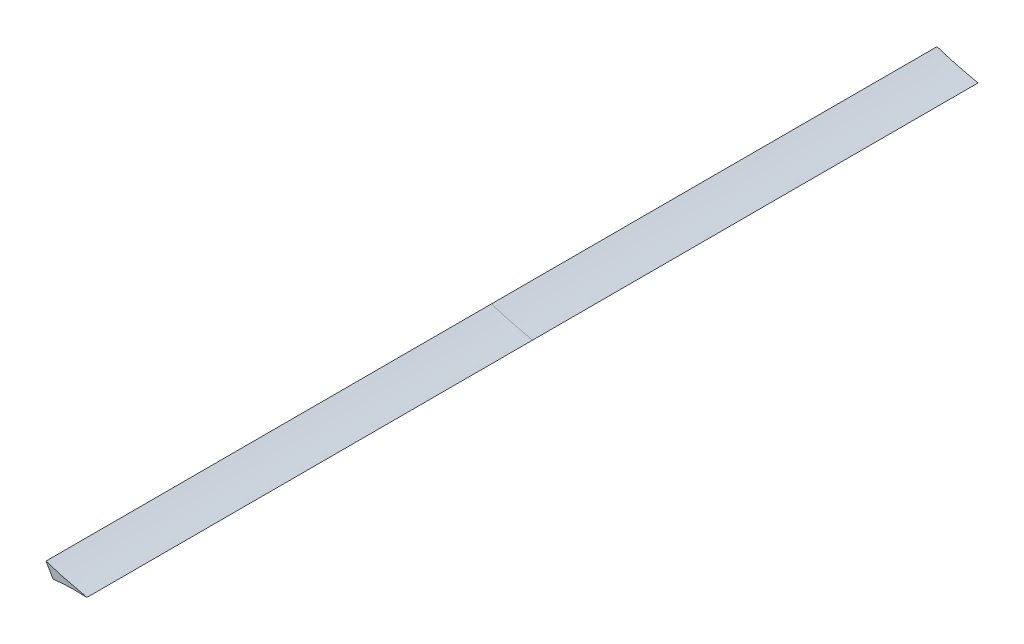
ISO-10303-21;
HEADER;
FILE_DESCRIPTION(('STEP AP214'),'2;1');
FILE_NAME('part.step','',(''),(''),'','','');
FILE_SCHEMA(('AUTOMOTIVE_DESIGN { 1 0 10303 214 1 1 1 1 }'));
ENDSEC;
DATA;
#1=APPLICATION_CONTEXT('core data for automotive mechanical design processes');
#2=APPLICATION_PROTOCOL_DEFINITION('international standard','automotive_design',2000,#1);
#3=PRODUCT_CONTEXT('',#1,'mechanical');
#4=PRODUCT('Part','Part','',(#3));
#5=PRODUCT_RELATED_PRODUCT_CATEGORY('part','',(#4));
#6=PRODUCT_DEFINITION_FORMATION('','',#4);
#7=PRODUCT_DEFINITION_CONTEXT('part definition',#1,'design');
#8=PRODUCT_DEFINITION('design','',#6,#7);
#9=PRODUCT_DEFINITION_SHAPE('','',#8);
#10=(LENGTH_UNIT() NAMED_UNIT(*) SI_UNIT(.MILLI.,.METRE.));
#11=(NAMED_UNIT(*) PLANE_ANGLE_UNIT() SI_UNIT($,.RADIAN.));
#12=(NAMED_UNIT(*) SI_UNIT($,.STERADIAN.) SOLID_ANGLE_UNIT());
#13=UNCERTAINTY_MEASURE_WITH_UNIT(LENGTH_MEASURE(1.E-05),#10,'distance_accuracy_value','');
#14=(GEOMETRIC_REPRESENTATION_CONTEXT(3) GLOBAL_UNCERTAINTY_ASSIGNED_CONTEXT((#13)) GLOBAL_UNIT_ASSIGNED_CONTEXT((#10,
#11,#12)) REPRESENTATION_CONTEXT('',''));
#15=CARTESIAN_POINT('',(0.,0.,0.));
#16=DIRECTION('',(0.,0.,1.));
#17=DIRECTION('',(1.,0.,0.));
#18=AXIS2_PLACEMENT_3D('',#15,#16,#17);
#19=CARTESIAN_POINT('',(0.,0.,225.));
#20=DIRECTION('',(0.,0.,1.));
#21=DIRECTION('',(1.,0.,0.));
#22=AXIS2_PLACEMENT_3D('',#19,#20,#21);
#23=PLANE('',#22);
#24=DIRECTION('',(0.499999999999995,-0.866025403784441,0.));
#25=VECTOR('',#24,1.);
#26=CARTESIAN_POINT('',(0.,6.45575704802336,225.));
#27=LINE('',#26,#25);
#28=CARTESIAN_POINT('',(0.,6.45575704802336,225.));
#29=VERTEX_POINT('',#28);
#30=CARTESIAN_POINT('',(3.50923831572054,0.377577989327863,225.));
#31=VERTEX_POINT('',#30);
#32=EDGE_CURVE('E77',#29,#31,#27,.T.);
#33=ORIENTED_EDGE('',*,*,#32,.T.);
#34=CARTESIAN_POINT('',(0.,0.,225.));
#35=CARTESIAN_POINT('',(0.143412686196248,0.016484913222827,225.));
#36=CARTESIAN_POINT('',(1.15599960637253,0.132169735232295,225.));
#37=CARTESIAN_POINT('',(2.20163152350003,0.245208217831339,225.));
#38=CARTESIAN_POINT('',(3.89642344180233,0.417340987119671,225.));
#39=CARTESIAN_POINT('',(4.75028727163423,0.498881267362469,225.));
#40=CARTESIAN_POINT('',(6.31461532335757,0.638348705882595,225.));
#41=CARTESIAN_POINT('',(7.1134768087235,0.704735468830722,225.));
#42=CARTESIAN_POINT('',(9.23243126054033,0.859157935634537,225.));
#43=CARTESIAN_POINT('',(10.6247063703936,0.935019609344665,225.));
#44=CARTESIAN_POINT('',(13.1229224374773,1.02816862060855,225.));
#45=CARTESIAN_POINT('',(14.2772598862957,1.05499027819146,225.));
#46=CARTESIAN_POINT('',(16.2290326857059,1.06953653121696,225.));
#47=CARTESIAN_POINT('',(17.0679399087013,1.06516197421244,225.));
#48=CARTESIAN_POINT('',(18.5748228619127,1.01721403613804,225.));
#49=CARTESIAN_POINT('',(19.2232515938076,0.986329802867523,225.));
#50=CARTESIAN_POINT('',(19.9647178327966,0.960926398622565,225.));
#51=CARTESIAN_POINT('',(20.1796426531521,0.955940474552006,225.));
#52=CARTESIAN_POINT('',(20.655932980956,0.922497650491091,225.));
#53=CARTESIAN_POINT('',(20.7683006143626,0.914396094678396,225.));
#54=CARTESIAN_POINT('',(20.6569168369895,0.938116524007671,225.));
#55=CARTESIAN_POINT('',(20.1716596740282,1.04349399864364,225.));
#56=CARTESIAN_POINT('',(19.9629663201964,1.10730144475082,225.));
#57=CARTESIAN_POINT('',(19.2301030709278,1.29991618176798,225.));
#58=CARTESIAN_POINT('',(18.579400137475,1.43689519078576,225.));
#59=CARTESIAN_POINT('',(17.064716887785,1.76430761965408,225.));
#60=CARTESIAN_POINT('',(16.2324187321515,1.95231091070916,225.));
#61=CARTESIAN_POINT('',(14.2778493461158,2.40356106670217,225.));
#62=CARTESIAN_POINT('',(13.1319193012487,2.67529946752668,225.));
#63=CARTESIAN_POINT('',(10.6235386488716,3.29081179250831,225.));
#64=CARTESIAN_POINT('',(9.24645056613313,3.6428334080049,225.));
#65=CARTESIAN_POINT('',(7.1171239213485,4.22396769928197,225.));
#66=CARTESIAN_POINT('',(6.33930323187018,4.44388241635937,225.));
#67=CARTESIAN_POINT('',(4.74987453359054,4.91290925443052,225.));
#68=CARTESIAN_POINT('',(3.05098286967538,5.43724376992468,225.));
#69=CARTESIAN_POINT('',(1.19982173982428,6.04772055569866,225.));
#70=CARTESIAN_POINT('',(0.168184003398421,6.39834523666102,225.));
#71=CARTESIAN_POINT('',(0.,6.45575704802336,225.));
#72=B_SPLINE_CURVE_WITH_KNOTS('',3,(#34,#35,#36,#37,#38,#39,#40,#41,#42,#43,#44,#45,#46,#47,#48,
#49,#50,#51,#52,#53,#54,#55,#56,#57,#58,#59,#60,#61,#62,#63,#64,#65,#66,#67,#68,#69,#70,#71),
.UNSPECIFIED.,.F.,.F.,(4,1,1,1,1,1,1,1,1,1,1,1,1,1,1,1,1,1,1,1,1,1,1,1,1,1,1,1,1,1,1,1,1,1,1,4),
(0.902429257890712,0.904464746292487,0.916799996916852,0.917258637759909,0.928486820557414,
0.928896231246836,0.939398012811482,0.939782451634662,0.958876519866814,0.959120139990651,
0.974883075914782,0.974987280763176,0.987050364706602,0.987125023612546,0.995254457623719,
0.995335095931589,0.999480576022632,0.999487806596392,1.,1.00052795687596,1.00053512169122,
1.00480669236207,1.00487594794478,1.01322439420952,1.01326482532404,1.02567252891684,
1.02569607156447,1.0419901069827,1.04209876043517,1.06195341422961,1.06210055225783,
1.0732482814661,1.07334331413919,1.08546199299339,1.09832036515421,1.10082631435623),.UNSPECIFIED.);
#73=EDGE_CURVE('E83',#31,#29,#72,.T.);
#74=ORIENTED_EDGE('',*,*,#73,.T.);
#75=EDGE_LOOP('',(#33,#74));
#76=FACE_BOUND('',#75,.T.);
#77=ADVANCED_FACE('F51',(#76),#23,.T.);
#78=CARTESIAN_POINT('',(0.,0.,450.));
#79=CARTESIAN_POINT('',(0.143412686196248,0.016484913222827,450.));
#80=CARTESIAN_POINT('',(1.15599960637253,0.132169735232295,450.));
#81=CARTESIAN_POINT('',(2.20163152350003,0.245208217831339,450.));
#82=CARTESIAN_POINT('',(3.89642344180233,0.417340987119671,450.));
#83=CARTESIAN_POINT('',(4.75028727163423,0.498881267362469,450.));
#84=CARTESIAN_POINT('',(6.31461532335757,0.638348705882595,450.));
#85=CARTESIAN_POINT('',(7.1134768087235,0.704735468830722,450.));
#86=CARTESIAN_POINT('',(9.23243126054033,0.859157935634537,450.));
#87=CARTESIAN_POINT('',(10.6247063703936,0.935019609344665,450.));
#88=CARTESIAN_POINT('',(13.1229224374773,1.02816862060855,450.));
#89=CARTESIAN_POINT('',(14.2772598862957,1.05499027819146,450.));
#90=CARTESIAN_POINT('',(16.2290326857059,1.06953653121696,450.));
#91=CARTESIAN_POINT('',(17.0679399087013,1.06516197421244,450.));
#92=CARTESIAN_POINT('',(18.5748228619127,1.01721403613804,450.));
#93=CARTESIAN_POINT('',(19.2232515938076,0.986329802867523,450.));
#94=CARTESIAN_POINT('',(19.9647178327966,0.960926398622565,450.));
#95=CARTESIAN_POINT('',(20.1796426531521,0.955940474552006,450.));
#96=CARTESIAN_POINT('',(20.655932980956,0.922497650491091,450.));
#97=CARTESIAN_POINT('',(20.7683006143626,0.914396094678396,450.));
#98=CARTESIAN_POINT('',(20.6569168369895,0.938116524007671,450.));
#99=CARTESIAN_POINT('',(20.1716596740282,1.04349399864364,450.));
#100=CARTESIAN_POINT('',(19.9629663201964,1.10730144475082,450.));
#101=CARTESIAN_POINT('',(19.2301030709278,1.29991618176798,450.));
#102=CARTESIAN_POINT('',(18.579400137475,1.43689519078576,450.));
#103=CARTESIAN_POINT('',(17.064716887785,1.76430761965408,450.));
#104=CARTESIAN_POINT('',(16.2324187321515,1.95231091070916,450.));
#105=CARTESIAN_POINT('',(14.2778493461158,2.40356106670217,450.));
#106=CARTESIAN_POINT('',(13.1319193012487,2.67529946752668,450.));
#107=CARTESIAN_POINT('',(10.6235386488716,3.29081179250831,450.));
#108=CARTESIAN_POINT('',(9.24645056613313,3.6428334080049,450.));
#109=CARTESIAN_POINT('',(7.1171239213485,4.22396769928197,450.));
#110=CARTESIAN_POINT('',(6.33930323187018,4.44388241635937,450.));
#111=CARTESIAN_POINT('',(4.74987453359054,4.91290925443052,450.));
#112=CARTESIAN_POINT('',(3.05098286967538,5.43724376992468,450.));
#113=CARTESIAN_POINT('',(1.19982173982428,6.04772055569866,450.));
#114=CARTESIAN_POINT('',(0.168184003398421,6.39834523666102,450.));
#115=CARTESIAN_POINT('',(0.,6.45575704802336,450.));
#116=B_SPLINE_CURVE_WITH_KNOTS('',3,(#78,#79,#80,#81,#82,#83,#84,#85,#86,#87,#88,#89,#90,#91,
#92,#93,#94,#95,#96,#97,#98,#99,#100,#101,#102,#103,#104,#105,#106,#107,#108,#109,#110,#111,
#112,#113,#114,#115),.UNSPECIFIED.,.F.,.F.,(4,1,1,1,1,1,1,1,1,1,1,1,1,1,1,1,1,1,1,1,1,1,1,1,1,1,
1,1,1,1,1,1,1,1,1,4),(0.902429257890712,0.904464746292487,0.916799996916852,0.917258637759909,
0.928486820557414,0.928896231246836,0.939398012811482,0.939782451634662,0.958876519866814,
0.959120139990651,0.974883075914782,0.974987280763176,0.987050364706602,0.987125023612546,
0.995254457623719,0.995335095931589,0.999480576022632,0.999487806596392,1.,1.00052795687596,
1.00053512169122,1.00480669236207,1.00487594794478,1.01322439420952,1.01326482532404,
1.02567252891684,1.02569607156447,1.0419901069827,1.04209876043517,1.06195341422961,
1.06210055225783,1.0732482814661,1.07334331413919,1.08546199299339,1.09832036515421,
1.10082631435623),.UNSPECIFIED.);
#117=DIRECTION('',(0.,0.,-1.));
#118=VECTOR('',#117,1.);
#119=SURFACE_OF_LINEAR_EXTRUSION('',#116,#118);
#120=ORIENTED_EDGE('',*,*,#73,.F.);
#121=DIRECTION('',(0.,0.,-1.));
#122=VECTOR('',#121,1.);
#123=CARTESIAN_POINT('',(3.50923831572054,0.377577989327863,450.));
#124=LINE('',#123,#122);
#125=CARTESIAN_POINT('',(3.50922685109894,0.377597781856291,-1.11022302462516E-13));
#126=VERTEX_POINT('',#125);
#127=EDGE_CURVE('E61',#31,#126,#124,.T.);
#128=ORIENTED_EDGE('',*,*,#127,.T.);
#129=CARTESIAN_POINT('',(3.50921951615823,0.377576118942169,-4.44089209850063E-13));
#130=CARTESIAN_POINT('',(4.17732519264434,0.444046596436541,-4.44089209850063E-13));
#131=CARTESIAN_POINT('',(4.87466279838623,0.509969949248333,-3.88578058618805E-13));
#132=CARTESIAN_POINT('',(6.31461532335757,0.638348705882595,-3.88578058618805E-13));
#133=CARTESIAN_POINT('',(7.1134768087235,0.704735468830722,-3.88578058618805E-13));
#134=CARTESIAN_POINT('',(9.23243126054033,0.859157935634537,-3.88578058618805E-13));
#135=CARTESIAN_POINT('',(10.6247063703936,0.935019609344665,-3.88578058618805E-13));
#136=CARTESIAN_POINT('',(13.1229224374773,1.02816862060855,-3.88578058618805E-13));
#137=CARTESIAN_POINT('',(14.2772598862957,1.05499027819146,-3.88578058618805E-13));
#138=CARTESIAN_POINT('',(16.2290326857059,1.06953653121696,-3.88578058618805E-13));
#139=CARTESIAN_POINT('',(17.0679399087013,1.06516197421244,-3.88578058618805E-13));
#140=CARTESIAN_POINT('',(18.5748228619127,1.01721403613804,-3.88578058618805E-13));
#141=CARTESIAN_POINT('',(19.2232515938076,0.986329802867523,-3.88578058618805E-13));
#142=CARTESIAN_POINT('',(19.9647178327966,0.960926398622565,-3.88578058618805E-13));
#143=CARTESIAN_POINT('',(20.1796426531521,0.955940474552006,-3.88578058618805E-13));
#144=CARTESIAN_POINT('',(20.655932980956,0.922497650491091,-3.88578058618805E-13));
#145=CARTESIAN_POINT('',(20.7683006143626,0.914396094678396,-3.88578058618805E-13));
#146=CARTESIAN_POINT('',(20.6569168369895,0.938116524007671,-3.88578058618805E-13));
#147=CARTESIAN_POINT('',(20.1716596740282,1.04349399864364,-3.88578058618805E-13));
#148=CARTESIAN_POINT('',(19.9629663201964,1.10730144475082,-3.88578058618805E-13));
#149=CARTESIAN_POINT('',(19.2301030709278,1.29991618176798,-3.88578058618805E-13));
#150=CARTESIAN_POINT('',(18.579400137475,1.43689519078576,-3.88578058618805E-13));
#151=CARTESIAN_POINT('',(17.064716887785,1.76430761965408,-3.88578058618805E-13));
#152=CARTESIAN_POINT('',(16.2324187321515,1.95231091070916,-3.88578058618805E-13));
#153=CARTESIAN_POINT('',(14.2778493461158,2.40356106670217,-3.88578058618805E-13));
#154=CARTESIAN_POINT('',(13.1319193012487,2.67529946752668,-3.88578058618805E-13));
#155=CARTESIAN_POINT('',(10.6235386488716,3.29081179250831,-3.88578058618805E-13));
#156=CARTESIAN_POINT('',(9.24645056613313,3.6428334080049,-3.88578058618805E-13));
#157=CARTESIAN_POINT('',(7.1171239213485,4.22396769928197,-3.88578058618805E-13));
#158=CARTESIAN_POINT('',(6.33930323187018,4.44388241635937,-3.88578058618805E-13));
#159=CARTESIAN_POINT('',(4.74987453359054,4.91290925443052,-3.88578058618805E-13));
#160=CARTESIAN_POINT('',(3.05098286967538,5.43724376992468,-3.88578058618805E-13));
#161=CARTESIAN_POINT('',(1.19982173982428,6.04772055569866,-3.88578058618805E-13));
#162=CARTESIAN_POINT('',(0.168184003398421,6.39834523666102,-3.88578058618805E-13));
#163=CARTESIAN_POINT('',(0.,6.45575704802336,-3.88578058618805E-13));
#164=B_SPLINE_CURVE_WITH_KNOTS('',3,(#129,#130,#131,#132,#133,#134,#135,#136,#137,#138,#139,
#140,#141,#142,#143,#144,#145,#146,#147,#148,#149,#150,#151,#152,#153,#154,#155,#156,#157,#158,
#159,#160,#161,#162,#163),.UNSPECIFIED.,.F.,.F.,(4,1,1,1,1,1,1,1,1,1,1,1,1,1,1,1,1,1,1,1,1,1,1,
1,1,1,1,1,1,1,1,1,4),(0.919018880076708,0.928486820557414,0.928896231246836,0.939398012811482,
0.939782451634662,0.958876519866814,0.959120139990651,0.974883075914782,0.974987280763176,
0.987050364706602,0.987125023612546,0.995254457623719,0.995335095931589,0.999480576022632,
0.999487806596392,1.,1.00052795687596,1.00053512169122,1.00480669236207,1.00487594794478,
1.01322439420952,1.01326482532404,1.02567252891684,1.02569607156447,1.0419901069827,
1.04209876043517,1.06195341422961,1.06210055225783,1.0732482814661,1.07334331413919,
1.08546199299339,1.09832036515421,1.10082631435623),.UNSPECIFIED.);
#165=CARTESIAN_POINT('',(0.,6.45575704802336,0.));
#166=VERTEX_POINT('',#165);
#167=EDGE_CURVE('E80',#126,#166,#164,.T.);
#168=ORIENTED_EDGE('',*,*,#167,.T.);
#169=DIRECTION('',(0.,0.,-1.));
#170=VECTOR('',#169,1.);
#171=CARTESIAN_POINT('',(0.,6.45575704802336,450.));
#172=LINE('',#171,#170);
#173=EDGE_CURVE('E85',#29,#166,#172,.T.);
#174=ORIENTED_EDGE('',*,*,#173,.F.);
#175=EDGE_LOOP('',(#120,#128,#168,#174));
#176=FACE_BOUND('',#175,.T.);
#177=ADVANCED_FACE('F84',(#176),#119,.F.);
#178=CARTESIAN_POINT('',(0.,6.45575704802336,450.));
#179=DIRECTION('',(0.866025403784441,0.499999999999995,0.));
#180=DIRECTION('',(-0.499999999999995,0.866025403784441,0.));
#181=AXIS2_PLACEMENT_3D('',#178,#179,#180);
#182=PLANE('',#181);
#183=ORIENTED_EDGE('',*,*,#32,.F.);
#184=ORIENTED_EDGE('',*,*,#173,.T.);
#185=DIRECTION('',(0.499999999999995,-0.866025403784441,0.));
#186=VECTOR('',#185,1.);
#187=CARTESIAN_POINT('',(0.,6.45575704802336,0.));
#188=LINE('',#187,#186);
#189=EDGE_CURVE('E12',#166,#126,#188,.T.);
#190=ORIENTED_EDGE('',*,*,#189,.T.);
#191=ORIENTED_EDGE('',*,*,#127,.F.);
#192=EDGE_LOOP('',(#183,#184,#190,#191));
#193=FACE_BOUND('',#192,.T.);
#194=ADVANCED_FACE('F53',(#193),#182,.F.);
#195=CARTESIAN_POINT('',(20.3113978002213,1.0163144752409,0.));
#196=DIRECTION('',(0.,0.,1.));
#197=DIRECTION('',(1.,0.,0.));
#198=AXIS2_PLACEMENT_3D('',#195,#196,#197);
#199=PLANE('',#198);
#200=ORIENTED_EDGE('',*,*,#167,.F.);
#201=ORIENTED_EDGE('',*,*,#189,.F.);
#202=EDGE_LOOP('',(#200,#201));
#203=FACE_BOUND('',#202,.T.);
#204=ADVANCED_FACE('F120',(#203),#199,.F.);
#205=CLOSED_SHELL('',(#77,#177,#194,#204));
#206=MANIFOLD_SOLID_BREP('B2',#205);
#207=CARTESIAN_POINT('',(0.,0.,225.));
#208=DIRECTION('',(0.,0.,1.));
#209=DIRECTION('',(1.,0.,0.));
#210=AXIS2_PLACEMENT_3D('',#207,#208,#209);
#211=PLANE('',#210);
#212=DIRECTION('',(0.499999999999995,-0.866025403784441,0.));
#213=VECTOR('',#212,1.);
#214=CARTESIAN_POINT('',(0.,6.45575704802336,225.));
#215=LINE('',#214,#213);
#216=CARTESIAN_POINT('',(0.,6.45575704802336,225.));
#217=VERTEX_POINT('',#216);
#218=CARTESIAN_POINT('',(3.50923831572054,0.377577989327863,225.));
#219=VERTEX_POINT('',#218);
#220=EDGE_CURVE('E167',#217,#219,#215,.T.);
#221=ORIENTED_EDGE('',*,*,#220,.F.);
#222=CARTESIAN_POINT('',(0.,0.,225.));
#223=CARTESIAN_POINT('',(0.143412686196248,0.016484913222827,225.));
#224=CARTESIAN_POINT('',(1.15599960637253,0.132169735232295,225.));
#225=CARTESIAN_POINT('',(2.20163152350003,0.245208217831339,225.));
#226=CARTESIAN_POINT('',(3.89642344180233,0.417340987119671,225.));
#227=CARTESIAN_POINT('',(4.75028727163423,0.498881267362469,225.));
#228=CARTESIAN_POINT('',(6.31461532335757,0.638348705882595,225.));
#229=CARTESIAN_POINT('',(7.1134768087235,0.704735468830722,225.));
#230=CARTESIAN_POINT('',(9.23243126054033,0.859157935634537,225.));
#231=CARTESIAN_POINT('',(10.6247063703936,0.935019609344665,225.));
#232=CARTESIAN_POINT('',(13.1229224374773,1.02816862060855,225.));
#233=CARTESIAN_POINT('',(14.2772598862957,1.05499027819146,225.));
#234=CARTESIAN_POINT('',(16.2290326857059,1.06953653121696,225.));
#235=CARTESIAN_POINT('',(17.0679399087013,1.06516197421244,225.));
#236=CARTESIAN_POINT('',(18.5748228619127,1.01721403613804,225.));
#237=CARTESIAN_POINT('',(19.2232515938076,0.986329802867523,225.));
#238=CARTESIAN_POINT('',(19.9647178327966,0.960926398622565,225.));
#239=CARTESIAN_POINT('',(20.1796426531521,0.955940474552006,225.));
#240=CARTESIAN_POINT('',(20.655932980956,0.922497650491091,225.));
#241=CARTESIAN_POINT('',(20.7683006143626,0.914396094678396,225.));
#242=CARTESIAN_POINT('',(20.6569168369895,0.938116524007671,225.));
#243=CARTESIAN_POINT('',(20.1716596740282,1.04349399864364,225.));
#244=CARTESIAN_POINT('',(19.9629663201964,1.10730144475082,225.));
#245=CARTESIAN_POINT('',(19.2301030709278,1.29991618176798,225.));
#246=CARTESIAN_POINT('',(18.579400137475,1.43689519078576,225.));
#247=CARTESIAN_POINT('',(17.064716887785,1.76430761965408,225.));
#248=CARTESIAN_POINT('',(16.2324187321515,1.95231091070916,225.));
#249=CARTESIAN_POINT('',(14.2778493461158,2.40356106670217,225.));
#250=CARTESIAN_POINT('',(13.1319193012487,2.67529946752668,225.));
#251=CARTESIAN_POINT('',(10.6235386488716,3.29081179250831,225.));
#252=CARTESIAN_POINT('',(9.24645056613313,3.6428334080049,225.));
#253=CARTESIAN_POINT('',(7.1171239213485,4.22396769928197,225.));
#254=CARTESIAN_POINT('',(6.33930323187018,4.44388241635937,225.));
#255=CARTESIAN_POINT('',(4.74987453359054,4.91290925443052,225.));
#256=CARTESIAN_POINT('',(3.05098286967538,5.43724376992468,225.));
#257=CARTESIAN_POINT('',(1.19982173982428,6.04772055569866,225.));
#258=CARTESIAN_POINT('',(0.168184003398421,6.39834523666102,225.));
#259=CARTESIAN_POINT('',(0.,6.45575704802336,225.));
#260=B_SPLINE_CURVE_WITH_KNOTS('',3,(#222,#223,#224,#225,#226,#227,#228,#229,#230,#231,#232,
#233,#234,#235,#236,#237,#238,#239,#240,#241,#242,#243,#244,#245,#246,#247,#248,#249,#250,#251,
#252,#253,#254,#255,#256,#257,#258,#259),.UNSPECIFIED.,.F.,.F.,(4,1,1,1,1,1,1,1,1,1,1,1,1,1,1,1,
1,1,1,1,1,1,1,1,1,1,1,1,1,1,1,1,1,1,1,4),(0.902429257890712,0.904464746292487,0.916799996916852,
0.917258637759909,0.928486820557414,0.928896231246836,0.939398012811482,0.939782451634662,
0.958876519866814,0.959120139990651,0.974883075914782,0.974987280763176,0.987050364706602,
0.987125023612546,0.995254457623719,0.995335095931589,0.999480576022632,0.999487806596392,1.,
1.00052795687596,1.00053512169122,1.00480669236207,1.00487594794478,1.01322439420952,
1.01326482532404,1.02567252891684,1.02569607156447,1.0419901069827,1.04209876043517,
1.06195341422961,1.06210055225783,1.0732482814661,1.07334331413919,1.08546199299339,
1.09832036515421,1.10082631435623),.UNSPECIFIED.);
#261=EDGE_CURVE('E49',#219,#217,#260,.T.);
#262=ORIENTED_EDGE('',*,*,#261,.F.);
#263=EDGE_LOOP('',(#221,#262));
#264=FACE_BOUND('',#263,.T.);
#265=ADVANCED_FACE('F158',(#264),#211,.F.);
#266=CARTESIAN_POINT('',(20.3113978002213,1.0163144752409,450.));
#267=DIRECTION('',(0.,0.,1.));
#268=DIRECTION('',(1.,0.,0.));
#269=AXIS2_PLACEMENT_3D('',#266,#267,#268);
#270=PLANE('',#269);
#271=DIRECTION('',(0.499999999999995,-0.866025403784441,0.));
#272=VECTOR('',#271,1.);
#273=CARTESIAN_POINT('',(0.,6.45575704802336,450.));
#274=LINE('',#273,#272);
#275=CARTESIAN_POINT('',(0.,6.45575704802336,450.));
#276=VERTEX_POINT('',#275);
#277=CARTESIAN_POINT('',(3.50921677336624,0.377615291498843,450.));
#278=VERTEX_POINT('',#277);
#279=EDGE_CURVE('E185',#276,#278,#274,.T.);
#280=ORIENTED_EDGE('',*,*,#279,.T.);
#281=CARTESIAN_POINT('',(0.,6.45575704802336,450.));
#282=CARTESIAN_POINT('',(0.168184003398421,6.39834523666102,450.));
#283=CARTESIAN_POINT('',(1.19982173982428,6.04772055569866,450.));
#284=CARTESIAN_POINT('',(3.05098286967538,5.43724376992468,450.));
#285=CARTESIAN_POINT('',(4.74987453359054,4.91290925443052,450.));
#286=CARTESIAN_POINT('',(6.33930323187018,4.44388241635937,450.));
#287=CARTESIAN_POINT('',(7.1171239213485,4.22396769928197,450.));
#288=CARTESIAN_POINT('',(9.24645056613313,3.6428334080049,450.));
#289=CARTESIAN_POINT('',(10.6235386488716,3.29081179250831,450.));
#290=CARTESIAN_POINT('',(13.1319193012487,2.67529946752668,450.));
#291=CARTESIAN_POINT('',(14.2778493461158,2.40356106670217,450.));
#292=CARTESIAN_POINT('',(16.2324187321515,1.95231091070916,450.));
#293=CARTESIAN_POINT('',(17.064716887785,1.76430761965408,450.));
#294=CARTESIAN_POINT('',(18.579400137475,1.43689519078576,450.));
#295=CARTESIAN_POINT('',(19.2301030709278,1.29991618176798,450.));
#296=CARTESIAN_POINT('',(19.9629663201964,1.10730144475082,450.));
#297=CARTESIAN_POINT('',(20.1716596740282,1.04349399864364,450.));
#298=CARTESIAN_POINT('',(20.6569168369895,0.938116524007671,450.));
#299=CARTESIAN_POINT('',(20.7683006143626,0.914396094678396,450.));
#300=CARTESIAN_POINT('',(20.655932980956,0.922497650491091,450.));
#301=CARTESIAN_POINT('',(20.1796426531521,0.955940474552006,450.));
#302=CARTESIAN_POINT('',(19.9647178327966,0.960926398622565,450.));
#303=CARTESIAN_POINT('',(19.2232515938076,0.986329802867523,450.));
#304=CARTESIAN_POINT('',(18.5748228619127,1.01721403613804,450.));
#305=CARTESIAN_POINT('',(17.0679399087013,1.06516197421244,450.));
#306=CARTESIAN_POINT('',(16.2290326857059,1.06953653121696,450.));
#307=CARTESIAN_POINT('',(14.2772598862957,1.05499027819146,450.));
#308=CARTESIAN_POINT('',(13.1229224374773,1.02816862060855,450.));
#309=CARTESIAN_POINT('',(10.6247063703936,0.935019609344665,450.));
#310=CARTESIAN_POINT('',(9.23243126054033,0.859157935634537,450.));
#311=CARTESIAN_POINT('',(7.1134768087235,0.704735468830722,450.));
#312=CARTESIAN_POINT('',(6.31461532335757,0.638348705882595,450.));
#313=CARTESIAN_POINT('',(4.87466317995826,0.509969983267332,450.));
#314=CARTESIAN_POINT('',(4.17732595515628,0.444046668521199,450.));
#315=CARTESIAN_POINT('',(3.50922065936546,0.377576232680955,450.));
#316=B_SPLINE_CURVE_WITH_KNOTS('',3,(#281,#282,#283,#284,#285,#286,#287,#288,#289,#290,#291,
#292,#293,#294,#295,#296,#297,#298,#299,#300,#301,#302,#303,#304,#305,#306,#307,#308,#309,#310,
#311,#312,#313,#314,#315),.UNSPECIFIED.,.F.,.F.,(4,1,1,1,1,1,1,1,1,1,1,1,1,1,1,1,1,1,1,1,1,1,1,
1,1,1,1,1,1,1,1,1,4),(0.91901888547696,0.921524834678983,0.934383206839795,0.946501885694002,
0.946596918367094,0.957744647575356,0.95789178560358,0.977746439398021,0.977855092850488,
0.994149128268717,0.994172670916348,1.00658037450915,1.00662080562367,1.01496925188841,
1.01503850747112,1.01931007814197,1.01931724295723,1.01984519983319,1.0203573932368,
1.02036462381056,1.0245101039016,1.02459074220947,1.03272017622064,1.03279483512659,
1.04485791907001,1.04496212391841,1.06072505984254,1.06096867996638,1.08006274819853,
1.08044718702171,1.09094896858635,1.09135837927578,1.10082631435623),.UNSPECIFIED.);
#317=EDGE_CURVE('E193',#278,#276,#316,.F.);
#318=ORIENTED_EDGE('',*,*,#317,.T.);
#319=EDGE_LOOP('',(#280,#318));
#320=FACE_BOUND('',#319,.T.);
#321=ADVANCED_FACE('F195',(#320),#270,.T.);
#322=CARTESIAN_POINT('',(0.,0.,450.));
#323=CARTESIAN_POINT('',(0.143412686196248,0.016484913222827,450.));
#324=CARTESIAN_POINT('',(1.15599960637253,0.132169735232295,450.));
#325=CARTESIAN_POINT('',(2.20163152350003,0.245208217831339,450.));
#326=CARTESIAN_POINT('',(3.89642344180233,0.417340987119671,450.));
#327=CARTESIAN_POINT('',(4.75028727163423,0.498881267362469,450.));
#328=CARTESIAN_POINT('',(6.31461532335757,0.638348705882595,450.));
#329=CARTESIAN_POINT('',(7.1134768087235,0.704735468830722,450.));
#330=CARTESIAN_POINT('',(9.23243126054033,0.859157935634537,450.));
#331=CARTESIAN_POINT('',(10.6247063703936,0.935019609344665,450.));
#332=CARTESIAN_POINT('',(13.1229224374773,1.02816862060855,450.));
#333=CARTESIAN_POINT('',(14.2772598862957,1.05499027819146,450.));
#334=CARTESIAN_POINT('',(16.2290326857059,1.06953653121696,450.));
#335=CARTESIAN_POINT('',(17.0679399087013,1.06516197421244,450.));
#336=CARTESIAN_POINT('',(18.5748228619127,1.01721403613804,450.));
#337=CARTESIAN_POINT('',(19.2232515938076,0.986329802867523,450.));
#338=CARTESIAN_POINT('',(19.9647178327966,0.960926398622565,450.));
#339=CARTESIAN_POINT('',(20.1796426531521,0.955940474552006,450.));
#340=CARTESIAN_POINT('',(20.655932980956,0.922497650491091,450.));
#341=CARTESIAN_POINT('',(20.7683006143626,0.914396094678396,450.));
#342=CARTESIAN_POINT('',(20.6569168369895,0.938116524007671,450.));
#343=CARTESIAN_POINT('',(20.1716596740282,1.04349399864364,450.));
#344=CARTESIAN_POINT('',(19.9629663201964,1.10730144475082,450.));
#345=CARTESIAN_POINT('',(19.2301030709278,1.29991618176798,450.));
#346=CARTESIAN_POINT('',(18.579400137475,1.43689519078576,450.));
#347=CARTESIAN_POINT('',(17.064716887785,1.76430761965408,450.));
#348=CARTESIAN_POINT('',(16.2324187321515,1.95231091070916,450.));
#349=CARTESIAN_POINT('',(14.2778493461158,2.40356106670217,450.));
#350=CARTESIAN_POINT('',(13.1319193012487,2.67529946752668,450.));
#351=CARTESIAN_POINT('',(10.6235386488716,3.29081179250831,450.));
#352=CARTESIAN_POINT('',(9.24645056613313,3.6428334080049,450.));
#353=CARTESIAN_POINT('',(7.1171239213485,4.22396769928197,450.));
#354=CARTESIAN_POINT('',(6.33930323187018,4.44388241635937,450.));
#355=CARTESIAN_POINT('',(4.74987453359054,4.91290925443052,450.));
#356=CARTESIAN_POINT('',(3.05098286967538,5.43724376992468,450.));
#357=CARTESIAN_POINT('',(1.19982173982428,6.04772055569866,450.));
#358=CARTESIAN_POINT('',(0.168184003398421,6.39834523666102,450.));
#359=CARTESIAN_POINT('',(0.,6.45575704802336,450.));
#360=B_SPLINE_CURVE_WITH_KNOTS('',3,(#322,#323,#324,#325,#326,#327,#328,#329,#330,#331,#332,
#333,#334,#335,#336,#337,#338,#339,#340,#341,#342,#343,#344,#345,#346,#347,#348,#349,#350,#351,
#352,#353,#354,#355,#356,#357,#358,#359),.UNSPECIFIED.,.F.,.F.,(4,1,1,1,1,1,1,1,1,1,1,1,1,1,1,1,
1,1,1,1,1,1,1,1,1,1,1,1,1,1,1,1,1,1,1,4),(0.902429257890712,0.904464746292487,0.916799996916852,
0.917258637759909,0.928486820557414,0.928896231246836,0.939398012811482,0.939782451634662,
0.958876519866814,0.959120139990651,0.974883075914782,0.974987280763176,0.987050364706602,
0.987125023612546,0.995254457623719,0.995335095931589,0.999480576022632,0.999487806596392,1.,
1.00052795687596,1.00053512169122,1.00480669236207,1.00487594794478,1.01322439420952,
1.01326482532404,1.02567252891684,1.02569607156447,1.0419901069827,1.04209876043517,
1.06195341422961,1.06210055225783,1.0732482814661,1.07334331413919,1.08546199299339,
1.09832036515421,1.10082631435623),.UNSPECIFIED.);
#361=DIRECTION('',(0.,0.,-1.));
#362=VECTOR('',#361,1.);
#363=SURFACE_OF_LINEAR_EXTRUSION('',#360,#362);
#364=DIRECTION('',(0.,0.,-1.));
#365=VECTOR('',#364,1.);
#366=CARTESIAN_POINT('',(3.50923831572054,0.377577989327863,450.));
#367=LINE('',#366,#365);
#368=EDGE_CURVE('E189',#278,#219,#367,.T.);
#369=ORIENTED_EDGE('',*,*,#368,.T.);
#370=ORIENTED_EDGE('',*,*,#261,.T.);
#371=DIRECTION('',(0.,0.,-1.));
#372=VECTOR('',#371,1.);
#373=CARTESIAN_POINT('',(0.,6.45575704802336,450.));
#374=LINE('',#373,#372);
#375=EDGE_CURVE('E188',#276,#217,#374,.T.);
#376=ORIENTED_EDGE('',*,*,#375,.F.);
#377=ORIENTED_EDGE('',*,*,#317,.F.);
#378=EDGE_LOOP('',(#369,#370,#376,#377));
#379=FACE_BOUND('',#378,.T.);
#380=ADVANCED_FACE('F199',(#379),#363,.F.);
#381=CARTESIAN_POINT('',(0.,6.45575704802336,450.));
#382=DIRECTION('',(0.866025403784441,0.499999999999995,0.));
#383=DIRECTION('',(-0.499999999999995,0.866025403784441,0.));
#384=AXIS2_PLACEMENT_3D('',#381,#382,#383);
#385=PLANE('',#384);
#386=ORIENTED_EDGE('',*,*,#375,.T.);
#387=ORIENTED_EDGE('',*,*,#220,.T.);
#388=ORIENTED_EDGE('',*,*,#368,.F.);
#389=ORIENTED_EDGE('',*,*,#279,.F.);
#390=EDGE_LOOP('',(#386,#387,#388,#389));
#391=FACE_BOUND('',#390,.T.);
#392=ADVANCED_FACE('F187',(#391),#385,.F.);
#393=CLOSED_SHELL('',(#265,#321,#380,#392));
#394=MANIFOLD_SOLID_BREP('B6',#393);
#395=ADVANCED_BREP_SHAPE_REPRESENTATION('',(#18,#206,#394),#14);
#396=SHAPE_DEFINITION_REPRESENTATION(#9,#395);
ENDSEC;
END-ISO-10303-21;
